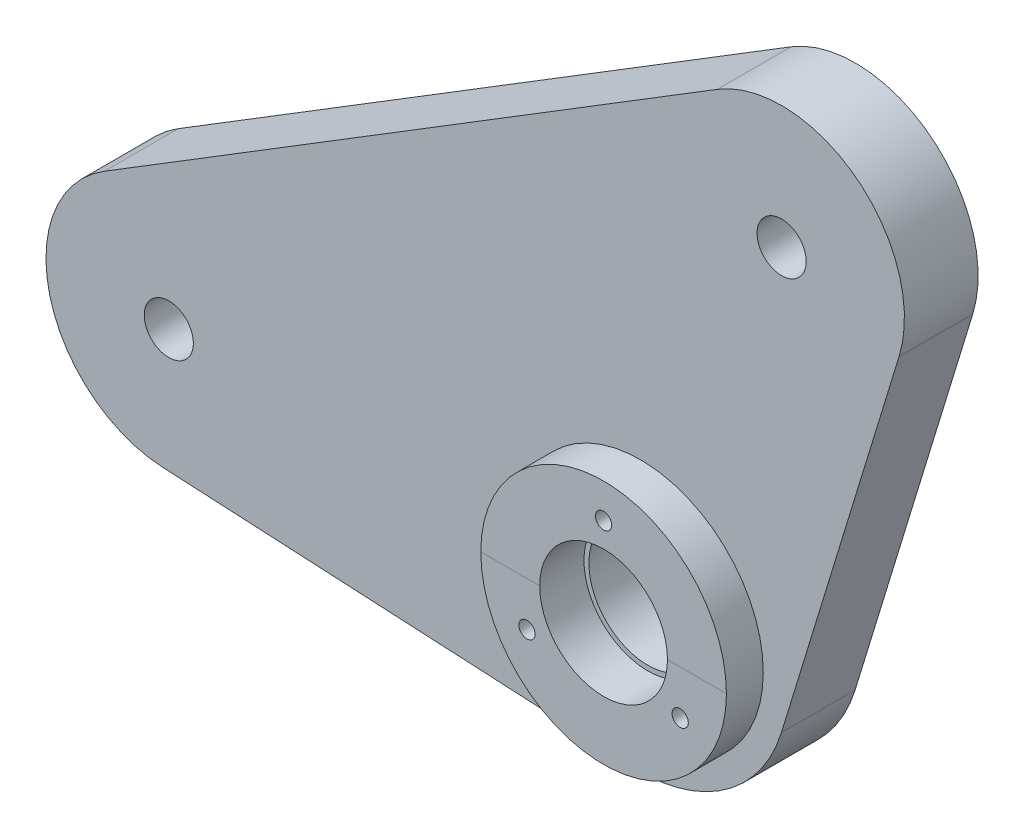
ISO-10303-21;
HEADER;
FILE_DESCRIPTION(('STEP AP214'),'2;1');
FILE_NAME('part.step','',(''),(''),'','','');
FILE_SCHEMA(('AUTOMOTIVE_DESIGN { 1 0 10303 214 1 1 1 1 }'));
ENDSEC;
DATA;
#1=APPLICATION_CONTEXT('core data for automotive mechanical design processes');
#2=APPLICATION_PROTOCOL_DEFINITION('international standard','automotive_design',2000,#1);
#3=PRODUCT_CONTEXT('',#1,'mechanical');
#4=PRODUCT('Part','Part','',(#3));
#5=PRODUCT_RELATED_PRODUCT_CATEGORY('part','',(#4));
#6=PRODUCT_DEFINITION_FORMATION('','',#4);
#7=PRODUCT_DEFINITION_CONTEXT('part definition',#1,'design');
#8=PRODUCT_DEFINITION('design','',#6,#7);
#9=PRODUCT_DEFINITION_SHAPE('','',#8);
#10=(LENGTH_UNIT() NAMED_UNIT(*) SI_UNIT(.MILLI.,.METRE.));
#11=(NAMED_UNIT(*) PLANE_ANGLE_UNIT() SI_UNIT($,.RADIAN.));
#12=(NAMED_UNIT(*) SI_UNIT($,.STERADIAN.) SOLID_ANGLE_UNIT());
#13=UNCERTAINTY_MEASURE_WITH_UNIT(LENGTH_MEASURE(1.E-05),#10,'distance_accuracy_value','');
#14=(GEOMETRIC_REPRESENTATION_CONTEXT(3) GLOBAL_UNCERTAINTY_ASSIGNED_CONTEXT((#13)) GLOBAL_UNIT_ASSIGNED_CONTEXT((#10,
#11,#12)) REPRESENTATION_CONTEXT('',''));
#15=CARTESIAN_POINT('',(0.,0.,0.));
#16=DIRECTION('',(0.,0.,1.));
#17=DIRECTION('',(1.,0.,0.));
#18=AXIS2_PLACEMENT_3D('',#15,#16,#17);
#19=CARTESIAN_POINT('',(0.,0.,15.));
#20=DIRECTION('',(0.,0.,1.));
#21=DIRECTION('',(1.,0.,0.));
#22=AXIS2_PLACEMENT_3D('',#19,#20,#21);
#23=PLANE('',#22);
#24=CARTESIAN_POINT('',(-15.5884572681198,-9.00000000000008,15.));
#25=DIRECTION('',(0.,0.,1.));
#26=DIRECTION('',(1.,0.,0.));
#27=AXIS2_PLACEMENT_3D('',#24,#25,#26);
#28=CIRCLE('',#27,1.64999999999999);
#29=CARTESIAN_POINT('',(-13.9384572681199,-9.00000000000008,15.));
#30=VERTEX_POINT('',#29);
#31=EDGE_CURVE('E178',#30,#30,#28,.T.);
#32=ORIENTED_EDGE('',*,*,#31,.F.);
#33=EDGE_LOOP('',(#32));
#34=FACE_BOUND('',#33,.T.);
#35=CARTESIAN_POINT('',(15.5884572681199,-9.00000000000007,15.));
#36=DIRECTION('',(0.,0.,1.));
#37=DIRECTION('',(1.,0.,0.));
#38=AXIS2_PLACEMENT_3D('',#35,#36,#37);
#39=CIRCLE('',#38,1.64999999999999);
#40=CARTESIAN_POINT('',(17.2384572681198,-9.00000000000007,15.));
#41=VERTEX_POINT('',#40);
#42=EDGE_CURVE('E172',#41,#41,#39,.T.);
#43=ORIENTED_EDGE('',*,*,#42,.F.);
#44=EDGE_LOOP('',(#43));
#45=FACE_BOUND('',#44,.T.);
#46=CARTESIAN_POINT('',(0.,0.,15.));
#47=DIRECTION('',(0.,0.,1.));
#48=DIRECTION('',(1.,0.,0.));
#49=AXIS2_PLACEMENT_3D('',#46,#47,#48);
#50=CIRCLE('',#49,13.);
#51=CARTESIAN_POINT('',(-13.,0.,15.));
#52=VERTEX_POINT('',#51);
#53=CARTESIAN_POINT('',(13.,0.,15.));
#54=VERTEX_POINT('',#53);
#55=EDGE_CURVE('E199',#52,#54,#50,.T.);
#56=ORIENTED_EDGE('',*,*,#55,.F.);
#57=DIRECTION('',(-1.,0.,0.));
#58=VECTOR('',#57,1.);
#59=CARTESIAN_POINT('',(0.,0.,15.));
#60=LINE('',#59,#58);
#61=CARTESIAN_POINT('',(-25.,0.,15.));
#62=VERTEX_POINT('',#61);
#63=EDGE_CURVE('E13',#52,#62,#60,.T.);
#64=ORIENTED_EDGE('',*,*,#63,.T.);
#65=CARTESIAN_POINT('',(0.,0.,15.));
#66=DIRECTION('',(0.,0.,1.));
#67=DIRECTION('',(1.,0.,0.));
#68=AXIS2_PLACEMENT_3D('',#65,#66,#67);
#69=CIRCLE('',#68,25.);
#70=CARTESIAN_POINT('',(25.,0.,15.));
#71=VERTEX_POINT('',#70);
#72=EDGE_CURVE('E304',#62,#71,#69,.T.);
#73=ORIENTED_EDGE('',*,*,#72,.T.);
#74=DIRECTION('',(-1.,0.,0.));
#75=VECTOR('',#74,1.);
#76=CARTESIAN_POINT('',(0.,0.,15.));
#77=LINE('',#76,#75);
#78=EDGE_CURVE('E65',#71,#54,#77,.T.);
#79=ORIENTED_EDGE('',*,*,#78,.T.);
#80=EDGE_LOOP('',(#56,#64,#73,#79));
#81=FACE_BOUND('',#80,.T.);
#82=ADVANCED_FACE('F56',(#34,#45,#81),#23,.T.);
#83=CARTESIAN_POINT('',(0.,0.,-15.));
#84=DIRECTION('',(0.,0.,1.));
#85=DIRECTION('',(1.,0.,0.));
#86=AXIS2_PLACEMENT_3D('',#83,#84,#85);
#87=CYLINDRICAL_SURFACE('',#86,12.);
#88=CARTESIAN_POINT('',(0.,0.,6.));
#89=DIRECTION('',(0.,0.,1.));
#90=DIRECTION('',(1.,0.,0.));
#91=AXIS2_PLACEMENT_3D('',#88,#89,#90);
#92=CIRCLE('',#91,12.);
#93=CARTESIAN_POINT('',(12.,0.,6.));
#94=VERTEX_POINT('',#93);
#95=EDGE_CURVE('E194',#94,#94,#92,.F.);
#96=ORIENTED_EDGE('',*,*,#95,.F.);
#97=EDGE_LOOP('',(#96));
#98=FACE_BOUND('',#97,.T.);
#99=CARTESIAN_POINT('',(0.,0.,-6.));
#100=DIRECTION('',(0.,0.,-1.));
#101=DIRECTION('',(-1.,0.,0.));
#102=AXIS2_PLACEMENT_3D('',#99,#100,#101);
#103=CIRCLE('',#102,12.);
#104=CARTESIAN_POINT('',(-12.,0.,-6.));
#105=VERTEX_POINT('',#104);
#106=EDGE_CURVE('E188',#105,#105,#103,.F.);
#107=ORIENTED_EDGE('',*,*,#106,.F.);
#108=EDGE_LOOP('',(#107));
#109=FACE_BOUND('',#108,.T.);
#110=ADVANCED_FACE('F327',(#98,#109),#87,.F.);
#111=CARTESIAN_POINT('',(-96.,0.,7.5));
#112=DIRECTION('',(0.,0.,-1.));
#113=DIRECTION('',(-1.,0.,0.));
#114=AXIS2_PLACEMENT_3D('',#111,#112,#113);
#115=CYLINDRICAL_SURFACE('',#114,25.);
#116=CARTESIAN_POINT('',(-96.,0.,-7.5));
#117=DIRECTION('',(0.,0.,1.));
#118=DIRECTION('',(1.,0.,0.));
#119=AXIS2_PLACEMENT_3D('',#116,#117,#118);
#120=CIRCLE('',#119,25.);
#121=CARTESIAN_POINT('',(-109.107307638029,21.2884589973548,-7.5));
#122=VERTEX_POINT('',#121);
#123=CARTESIAN_POINT('',(-97.3020833333333,-24.9660685529992,-7.5));
#124=VERTEX_POINT('',#123);
#125=EDGE_CURVE('E279',#122,#124,#120,.T.);
#126=ORIENTED_EDGE('',*,*,#125,.T.);
#127=DIRECTION('',(0.,0.,-1.));
#128=VECTOR('',#127,1.);
#129=CARTESIAN_POINT('',(-97.3020833333333,-24.9660685529992,7.5));
#130=LINE('',#129,#128);
#131=CARTESIAN_POINT('',(-97.3020833333333,-24.9660685529992,7.5));
#132=VERTEX_POINT('',#131);
#133=EDGE_CURVE('E292',#132,#124,#130,.T.);
#134=ORIENTED_EDGE('',*,*,#133,.F.);
#135=CARTESIAN_POINT('',(-96.,0.,7.5));
#136=DIRECTION('',(0.,0.,1.));
#137=DIRECTION('',(1.,0.,0.));
#138=AXIS2_PLACEMENT_3D('',#135,#136,#137);
#139=CIRCLE('',#138,25.);
#140=CARTESIAN_POINT('',(-109.107307638029,21.2884589973548,7.5));
#141=VERTEX_POINT('',#140);
#142=EDGE_CURVE('E234',#141,#132,#139,.T.);
#143=ORIENTED_EDGE('',*,*,#142,.F.);
#144=DIRECTION('',(0.,0.,-1.));
#145=VECTOR('',#144,1.);
#146=CARTESIAN_POINT('',(-109.107307638029,21.2884589973548,7.5));
#147=LINE('',#146,#145);
#148=EDGE_CURVE('E273',#141,#122,#147,.T.);
#149=ORIENTED_EDGE('',*,*,#148,.T.);
#150=EDGE_LOOP('',(#126,#134,#143,#149));
#151=FACE_BOUND('',#150,.T.);
#152=ADVANCED_FACE('F58',(#151),#115,.T.);
#153=CARTESIAN_POINT('',(-97.3020833333333,-24.9660685529992,7.5));
#154=DIRECTION('',(0.0520833333333332,0.998642742119968,0.));
#155=DIRECTION('',(-0.998642742119968,0.0520833333333332,0.));
#156=AXIS2_PLACEMENT_3D('',#153,#154,#155);
#157=PLANE('',#156);
#158=DIRECTION('',(0.998642742119968,-0.0520833333333332,0.));
#159=VECTOR('',#158,1.);
#160=CARTESIAN_POINT('',(-97.3020833333333,-24.9660685529992,-7.5));
#161=LINE('',#160,#159);
#162=CARTESIAN_POINT('',(-1.5625,-29.959282263599,-7.5));
#163=VERTEX_POINT('',#162);
#164=EDGE_CURVE('E282',#124,#163,#161,.T.);
#165=ORIENTED_EDGE('',*,*,#164,.T.);
#166=DIRECTION('',(0.,0.,-1.));
#167=VECTOR('',#166,1.);
#168=CARTESIAN_POINT('',(-1.5625,-29.959282263599,7.5));
#169=LINE('',#168,#167);
#170=CARTESIAN_POINT('',(-1.5625,-29.959282263599,7.5));
#171=VERTEX_POINT('',#170);
#172=EDGE_CURVE('E257',#171,#163,#169,.T.);
#173=ORIENTED_EDGE('',*,*,#172,.F.);
#174=DIRECTION('',(0.998642742119968,-0.0520833333333332,0.));
#175=VECTOR('',#174,1.);
#176=CARTESIAN_POINT('',(-97.3020833333333,-24.9660685529992,7.5));
#177=LINE('',#176,#175);
#178=EDGE_CURVE('E237',#132,#171,#177,.T.);
#179=ORIENTED_EDGE('',*,*,#178,.F.);
#180=ORIENTED_EDGE('',*,*,#133,.T.);
#181=EDGE_LOOP('',(#165,#173,#179,#180));
#182=FACE_BOUND('',#181,.T.);
#183=ADVANCED_FACE('F377',(#182),#157,.F.);
#184=CARTESIAN_POINT('',(0.,0.,7.5));
#185=DIRECTION('',(0.,0.,-1.));
#186=DIRECTION('',(-1.,0.,0.));
#187=AXIS2_PLACEMENT_3D('',#184,#185,#186);
#188=CYLINDRICAL_SURFACE('',#187,30.);
#189=CARTESIAN_POINT('',(0.,0.,-7.5));
#190=DIRECTION('',(0.,0.,1.));
#191=DIRECTION('',(1.,0.,0.));
#192=AXIS2_PLACEMENT_3D('',#189,#190,#191);
#193=CIRCLE('',#192,30.);
#194=CARTESIAN_POINT('',(28.6863265068597,-8.78035714204369,-7.5));
#195=VERTEX_POINT('',#194);
#196=EDGE_CURVE('E254',#163,#195,#193,.T.);
#197=ORIENTED_EDGE('',*,*,#196,.T.);
#198=DIRECTION('',(0.,0.,-1.));
#199=VECTOR('',#198,1.);
#200=CARTESIAN_POINT('',(28.6863265068597,-8.78035714204369,7.5));
#201=LINE('',#200,#199);
#202=CARTESIAN_POINT('',(28.6863265068597,-8.78035714204369,7.5));
#203=VERTEX_POINT('',#202);
#204=EDGE_CURVE('E251',#203,#195,#201,.T.);
#205=ORIENTED_EDGE('',*,*,#204,.F.);
#206=CARTESIAN_POINT('',(0.,0.,7.5));
#207=DIRECTION('',(0.,0.,1.));
#208=DIRECTION('',(1.,0.,0.));
#209=AXIS2_PLACEMENT_3D('',#206,#207,#208);
#210=CIRCLE('',#209,30.);
#211=EDGE_CURVE('E211',#171,#203,#210,.T.);
#212=ORIENTED_EDGE('',*,*,#211,.F.);
#213=ORIENTED_EDGE('',*,*,#172,.T.);
#214=EDGE_LOOP('',(#197,#205,#212,#213));
#215=FACE_BOUND('',#214,.T.);
#216=ADVANCED_FACE('F252',(#215),#188,.T.);
#217=CARTESIAN_POINT('',(28.6863265068597,-8.78035714204369,7.5));
#218=DIRECTION('',(-0.956210883561991,0.292678571401456,0.));
#219=DIRECTION('',(-0.292678571401456,-0.956210883561991,0.));
#220=AXIS2_PLACEMENT_3D('',#217,#218,#219);
#221=PLANE('',#220);
#222=DIRECTION('',(0.292678571401456,0.956210883561991,0.));
#223=VECTOR('',#222,1.);
#224=CARTESIAN_POINT('',(28.6863265068597,-8.78035714204369,-7.5));
#225=LINE('',#224,#223);
#226=CARTESIAN_POINT('',(52.6413121781087,69.4830357149636,-7.5));
#227=VERTEX_POINT('',#226);
#228=EDGE_CURVE('E263',#195,#227,#225,.T.);
#229=ORIENTED_EDGE('',*,*,#228,.T.);
#230=DIRECTION('',(0.,0.,-1.));
#231=VECTOR('',#230,1.);
#232=CARTESIAN_POINT('',(52.6413121781087,69.4830357149636,7.5));
#233=LINE('',#232,#231);
#234=CARTESIAN_POINT('',(52.6413121781087,69.4830357149636,7.5));
#235=VERTEX_POINT('',#234);
#236=EDGE_CURVE('E258',#235,#227,#233,.T.);
#237=ORIENTED_EDGE('',*,*,#236,.F.);
#238=DIRECTION('',(0.292678571401456,0.956210883561991,0.));
#239=VECTOR('',#238,1.);
#240=CARTESIAN_POINT('',(28.6863265068597,-8.78035714204369,7.5));
#241=LINE('',#240,#239);
#242=EDGE_CURVE('E206',#203,#235,#241,.T.);
#243=ORIENTED_EDGE('',*,*,#242,.F.);
#244=ORIENTED_EDGE('',*,*,#204,.T.);
#245=EDGE_LOOP('',(#229,#237,#243,#244));
#246=FACE_BOUND('',#245,.T.);
#247=ADVANCED_FACE('F260',(#246),#221,.F.);
#248=CARTESIAN_POINT('',(28.7360400890589,76.8,7.5));
#249=DIRECTION('',(0.,0.,-1.));
#250=DIRECTION('',(-1.,0.,0.));
#251=AXIS2_PLACEMENT_3D('',#248,#249,#250);
#252=CYLINDRICAL_SURFACE('',#251,25.);
#253=CARTESIAN_POINT('',(28.7360400890589,76.8,-7.5));
#254=DIRECTION('',(0.,0.,1.));
#255=DIRECTION('',(1.,0.,0.));
#256=AXIS2_PLACEMENT_3D('',#253,#254,#255);
#257=CIRCLE('',#256,25.);
#258=CARTESIAN_POINT('',(15.6287324510297,98.0884589973549,-7.5));
#259=VERTEX_POINT('',#258);
#260=EDGE_CURVE('E287',#227,#259,#257,.T.);
#261=ORIENTED_EDGE('',*,*,#260,.T.);
#262=DIRECTION('',(0.,0.,-1.));
#263=VECTOR('',#262,1.);
#264=CARTESIAN_POINT('',(15.6287324510297,98.0884589973549,7.5));
#265=LINE('',#264,#263);
#266=CARTESIAN_POINT('',(15.6287324510297,98.0884589973549,7.5));
#267=VERTEX_POINT('',#266);
#268=EDGE_CURVE('E266',#267,#259,#265,.T.);
#269=ORIENTED_EDGE('',*,*,#268,.F.);
#270=CARTESIAN_POINT('',(28.7360400890589,76.8,7.5));
#271=DIRECTION('',(0.,0.,1.));
#272=DIRECTION('',(1.,0.,0.));
#273=AXIS2_PLACEMENT_3D('',#270,#271,#272);
#274=CIRCLE('',#273,25.);
#275=EDGE_CURVE('E210',#235,#267,#274,.T.);
#276=ORIENTED_EDGE('',*,*,#275,.F.);
#277=ORIENTED_EDGE('',*,*,#236,.T.);
#278=EDGE_LOOP('',(#261,#269,#276,#277));
#279=FACE_BOUND('',#278,.T.);
#280=ADVANCED_FACE('F269',(#279),#252,.T.);
#281=CARTESIAN_POINT('',(-109.107307638029,21.2884589973548,7.5));
#282=DIRECTION('',(0.524292305521172,-0.851538359894194,0.));
#283=DIRECTION('',(0.851538359894194,0.524292305521172,0.));
#284=AXIS2_PLACEMENT_3D('',#281,#282,#283);
#285=PLANE('',#284);
#286=DIRECTION('',(-0.851538359894194,-0.524292305521172,0.));
#287=VECTOR('',#286,1.);
#288=CARTESIAN_POINT('',(-109.107307638029,21.2884589973548,-7.5));
#289=LINE('',#288,#287);
#290=EDGE_CURVE('E238',#259,#122,#289,.T.);
#291=ORIENTED_EDGE('',*,*,#290,.T.);
#292=ORIENTED_EDGE('',*,*,#148,.F.);
#293=DIRECTION('',(-0.851538359894194,-0.524292305521172,0.));
#294=VECTOR('',#293,1.);
#295=CARTESIAN_POINT('',(-109.107307638029,21.2884589973548,7.5));
#296=LINE('',#295,#294);
#297=EDGE_CURVE('E272',#267,#141,#296,.T.);
#298=ORIENTED_EDGE('',*,*,#297,.F.);
#299=ORIENTED_EDGE('',*,*,#268,.T.);
#300=EDGE_LOOP('',(#291,#292,#298,#299));
#301=FACE_BOUND('',#300,.T.);
#302=ADVANCED_FACE('F364',(#301),#285,.F.);
#303=CARTESIAN_POINT('',(-96.,0.,7.5));
#304=DIRECTION('',(0.,0.,1.));
#305=DIRECTION('',(1.,0.,0.));
#306=AXIS2_PLACEMENT_3D('',#303,#304,#305);
#307=PLANE('',#306);
#308=CARTESIAN_POINT('',(0.,0.,7.5));
#309=DIRECTION('',(0.,0.,1.));
#310=DIRECTION('',(1.,0.,0.));
#311=AXIS2_PLACEMENT_3D('',#308,#309,#310);
#312=CIRCLE('',#311,25.);
#313=CARTESIAN_POINT('',(25.,0.,7.5));
#314=VERTEX_POINT('',#313);
#315=EDGE_CURVE('E233',#314,#314,#312,.F.);
#316=ORIENTED_EDGE('',*,*,#315,.T.);
#317=EDGE_LOOP('',(#316));
#318=FACE_BOUND('',#317,.T.);
#319=CARTESIAN_POINT('',(-96.,0.,7.5));
#320=DIRECTION('',(0.,0.,1.));
#321=DIRECTION('',(1.,0.,0.));
#322=AXIS2_PLACEMENT_3D('',#319,#320,#321);
#323=CIRCLE('',#322,5.);
#324=CARTESIAN_POINT('',(-91.,0.,7.5));
#325=VERTEX_POINT('',#324);
#326=EDGE_CURVE('E226',#325,#325,#323,.T.);
#327=ORIENTED_EDGE('',*,*,#326,.F.);
#328=EDGE_LOOP('',(#327));
#329=FACE_BOUND('',#328,.T.);
#330=CARTESIAN_POINT('',(28.7360400890589,76.8,7.5));
#331=DIRECTION('',(0.,0.,1.));
#332=DIRECTION('',(1.,0.,0.));
#333=AXIS2_PLACEMENT_3D('',#330,#331,#332);
#334=CIRCLE('',#333,5.);
#335=CARTESIAN_POINT('',(33.7360400890589,76.8,7.5));
#336=VERTEX_POINT('',#335);
#337=EDGE_CURVE('E222',#336,#336,#334,.T.);
#338=ORIENTED_EDGE('',*,*,#337,.F.);
#339=EDGE_LOOP('',(#338));
#340=FACE_BOUND('',#339,.T.);
#341=ORIENTED_EDGE('',*,*,#142,.T.);
#342=ORIENTED_EDGE('',*,*,#178,.T.);
#343=ORIENTED_EDGE('',*,*,#211,.T.);
#344=ORIENTED_EDGE('',*,*,#242,.T.);
#345=ORIENTED_EDGE('',*,*,#275,.T.);
#346=ORIENTED_EDGE('',*,*,#297,.T.);
#347=EDGE_LOOP('',(#341,#342,#343,#344,#345,#346));
#348=FACE_BOUND('',#347,.T.);
#349=ADVANCED_FACE('F245',(#318,#329,#340,#348),#307,.T.);
#350=CARTESIAN_POINT('',(-96.,0.,-7.5));
#351=DIRECTION('',(0.,0.,1.));
#352=DIRECTION('',(1.,0.,0.));
#353=AXIS2_PLACEMENT_3D('',#350,#351,#352);
#354=PLANE('',#353);
#355=CARTESIAN_POINT('',(0.,0.,-7.5));
#356=DIRECTION('',(0.,0.,1.));
#357=DIRECTION('',(1.,0.,0.));
#358=AXIS2_PLACEMENT_3D('',#355,#356,#357);
#359=CIRCLE('',#358,25.);
#360=CARTESIAN_POINT('',(25.,0.,-7.5));
#361=VERTEX_POINT('',#360);
#362=EDGE_CURVE('E295',#361,#361,#359,.F.);
#363=ORIENTED_EDGE('',*,*,#362,.F.);
#364=EDGE_LOOP('',(#363));
#365=FACE_BOUND('',#364,.T.);
#366=CARTESIAN_POINT('',(-96.,0.,-7.5));
#367=DIRECTION('',(0.,0.,1.));
#368=DIRECTION('',(1.,0.,0.));
#369=AXIS2_PLACEMENT_3D('',#366,#367,#368);
#370=CIRCLE('',#369,5.);
#371=CARTESIAN_POINT('',(-91.,0.,-7.5));
#372=VERTEX_POINT('',#371);
#373=EDGE_CURVE('E283',#372,#372,#370,.T.);
#374=ORIENTED_EDGE('',*,*,#373,.T.);
#375=EDGE_LOOP('',(#374));
#376=FACE_BOUND('',#375,.T.);
#377=CARTESIAN_POINT('',(28.7360400890589,76.8,-7.5));
#378=DIRECTION('',(0.,0.,1.));
#379=DIRECTION('',(1.,0.,0.));
#380=AXIS2_PLACEMENT_3D('',#377,#378,#379);
#381=CIRCLE('',#380,5.);
#382=CARTESIAN_POINT('',(33.7360400890589,76.8,-7.5));
#383=VERTEX_POINT('',#382);
#384=EDGE_CURVE('E227',#383,#383,#381,.T.);
#385=ORIENTED_EDGE('',*,*,#384,.T.);
#386=EDGE_LOOP('',(#385));
#387=FACE_BOUND('',#386,.T.);
#388=ORIENTED_EDGE('',*,*,#125,.F.);
#389=ORIENTED_EDGE('',*,*,#290,.F.);
#390=ORIENTED_EDGE('',*,*,#260,.F.);
#391=ORIENTED_EDGE('',*,*,#228,.F.);
#392=ORIENTED_EDGE('',*,*,#196,.F.);
#393=ORIENTED_EDGE('',*,*,#164,.F.);
#394=EDGE_LOOP('',(#388,#389,#390,#391,#392,#393));
#395=FACE_BOUND('',#394,.T.);
#396=ADVANCED_FACE('F360',(#365,#376,#387,#395),#354,.F.);
#397=CARTESIAN_POINT('',(28.7360400890589,76.8,-7.5));
#398=DIRECTION('',(0.,0.,1.));
#399=DIRECTION('',(1.,0.,0.));
#400=AXIS2_PLACEMENT_3D('',#397,#398,#399);
#401=CYLINDRICAL_SURFACE('',#400,5.);
#402=ORIENTED_EDGE('',*,*,#384,.F.);
#403=EDGE_LOOP('',(#402));
#404=FACE_BOUND('',#403,.T.);
#405=ORIENTED_EDGE('',*,*,#337,.T.);
#406=EDGE_LOOP('',(#405));
#407=FACE_BOUND('',#406,.T.);
#408=ADVANCED_FACE('F356',(#404,#407),#401,.F.);
#409=CARTESIAN_POINT('',(-96.,0.,-7.5));
#410=DIRECTION('',(0.,0.,1.));
#411=DIRECTION('',(1.,0.,0.));
#412=AXIS2_PLACEMENT_3D('',#409,#410,#411);
#413=CYLINDRICAL_SURFACE('',#412,5.);
#414=ORIENTED_EDGE('',*,*,#373,.F.);
#415=EDGE_LOOP('',(#414));
#416=FACE_BOUND('',#415,.T.);
#417=ORIENTED_EDGE('',*,*,#326,.T.);
#418=EDGE_LOOP('',(#417));
#419=FACE_BOUND('',#418,.T.);
#420=ADVANCED_FACE('F353',(#416,#419),#413,.F.);
#421=CARTESIAN_POINT('',(0.,0.,-15.));
#422=DIRECTION('',(0.,0.,1.));
#423=DIRECTION('',(1.,0.,0.));
#424=AXIS2_PLACEMENT_3D('',#421,#422,#423);
#425=PLANE('',#424);
#426=CARTESIAN_POINT('',(0.,18.,-15.));
#427=DIRECTION('',(0.,0.,-1.));
#428=DIRECTION('',(-1.,0.,0.));
#429=AXIS2_PLACEMENT_3D('',#426,#427,#428);
#430=CIRCLE('',#429,1.64999999999999);
#431=CARTESIAN_POINT('',(-1.64999999999999,18.,-15.));
#432=VERTEX_POINT('',#431);
#433=EDGE_CURVE('E150',#432,#432,#430,.T.);
#434=ORIENTED_EDGE('',*,*,#433,.F.);
#435=EDGE_LOOP('',(#434));
#436=FACE_BOUND('',#435,.T.);
#437=CARTESIAN_POINT('',(-15.5854674215915,-8.99827381130211,-15.));
#438=DIRECTION('',(0.,0.,-1.));
#439=DIRECTION('',(-1.,0.,0.));
#440=AXIS2_PLACEMENT_3D('',#437,#438,#439);
#441=CIRCLE('',#440,1.64999999999999);
#442=CARTESIAN_POINT('',(-17.2354674215915,-8.99827381130211,-15.));
#443=VERTEX_POINT('',#442);
#444=EDGE_CURVE('E149',#443,#443,#441,.T.);
#445=ORIENTED_EDGE('',*,*,#444,.F.);
#446=EDGE_LOOP('',(#445));
#447=FACE_BOUND('',#446,.T.);
#448=CARTESIAN_POINT('',(15.5884572681198,-9.00000000000008,-15.));
#449=DIRECTION('',(0.,0.,-1.));
#450=DIRECTION('',(-1.,0.,0.));
#451=AXIS2_PLACEMENT_3D('',#448,#449,#450);
#452=CIRCLE('',#451,1.64999999999999);
#453=CARTESIAN_POINT('',(13.9384572681199,-9.00000000000008,-15.));
#454=VERTEX_POINT('',#453);
#455=EDGE_CURVE('E160',#454,#454,#452,.T.);
#456=ORIENTED_EDGE('',*,*,#455,.F.);
#457=EDGE_LOOP('',(#456));
#458=FACE_BOUND('',#457,.T.);
#459=CARTESIAN_POINT('',(0.,0.,-15.));
#460=DIRECTION('',(0.,0.,-1.));
#461=DIRECTION('',(-1.,0.,0.));
#462=AXIS2_PLACEMENT_3D('',#459,#460,#461);
#463=CIRCLE('',#462,13.);
#464=CARTESIAN_POINT('',(-13.,0.,-15.));
#465=VERTEX_POINT('',#464);
#466=EDGE_CURVE('E184',#465,#465,#463,.T.);
#467=ORIENTED_EDGE('',*,*,#466,.F.);
#468=EDGE_LOOP('',(#467));
#469=FACE_BOUND('',#468,.T.);
#470=CARTESIAN_POINT('',(0.,0.,-15.));
#471=DIRECTION('',(0.,0.,1.));
#472=DIRECTION('',(1.,0.,0.));
#473=AXIS2_PLACEMENT_3D('',#470,#471,#472);
#474=CIRCLE('',#473,25.);
#475=CARTESIAN_POINT('',(25.,0.,-15.));
#476=VERTEX_POINT('',#475);
#477=EDGE_CURVE('E300',#476,#476,#474,.T.);
#478=ORIENTED_EDGE('',*,*,#477,.F.);
#479=EDGE_LOOP('',(#478));
#480=FACE_BOUND('',#479,.T.);
#481=ADVANCED_FACE('F348',(#436,#447,#458,#469,#480),#425,.F.);
#482=CARTESIAN_POINT('',(0.,0.,15.));
#483=DIRECTION('',(0.,0.,-1.));
#484=DIRECTION('',(-1.,0.,0.));
#485=AXIS2_PLACEMENT_3D('',#482,#483,#484);
#486=CYLINDRICAL_SURFACE('',#485,25.);
#487=ORIENTED_EDGE('',*,*,#477,.T.);
#488=EDGE_LOOP('',(#487));
#489=FACE_BOUND('',#488,.T.);
#490=ORIENTED_EDGE('',*,*,#362,.T.);
#491=EDGE_LOOP('',(#490));
#492=FACE_BOUND('',#491,.T.);
#493=ADVANCED_FACE('F342',(#489,#492),#486,.T.);
#494=ORIENTED_EDGE('',*,*,#315,.F.);
#495=EDGE_LOOP('',(#494));
#496=FACE_BOUND('',#495,.T.);
#497=EDGE_CURVE('E200',#71,#62,#69,.T.);
#498=ORIENTED_EDGE('',*,*,#497,.F.);
#499=ORIENTED_EDGE('',*,*,#72,.F.);
#500=EDGE_LOOP('',(#498,#499));
#501=FACE_BOUND('',#500,.T.);
#502=ADVANCED_FACE('F338',(#496,#501),#486,.T.);
#503=ORIENTED_EDGE('',*,*,#63,.F.);
#504=EDGE_CURVE('E195',#54,#52,#50,.T.);
#505=ORIENTED_EDGE('',*,*,#504,.F.);
#506=ORIENTED_EDGE('',*,*,#78,.F.);
#507=ORIENTED_EDGE('',*,*,#497,.T.);
#508=EDGE_LOOP('',(#503,#505,#506,#507));
#509=FACE_BOUND('',#508,.T.);
#510=CARTESIAN_POINT('',(0.,18.,15.));
#511=DIRECTION('',(0.,0.,1.));
#512=DIRECTION('',(1.,0.,0.));
#513=AXIS2_PLACEMENT_3D('',#510,#511,#512);
#514=CIRCLE('',#513,1.64999999999999);
#515=CARTESIAN_POINT('',(1.64999999999999,18.,15.));
#516=VERTEX_POINT('',#515);
#517=EDGE_CURVE('E166',#516,#516,#514,.T.);
#518=ORIENTED_EDGE('',*,*,#517,.F.);
#519=EDGE_LOOP('',(#518));
#520=FACE_BOUND('',#519,.T.);
#521=ADVANCED_FACE('F306',(#509,#520),#23,.T.);
#522=CARTESIAN_POINT('',(0.,0.,6.));
#523=DIRECTION('',(0.,0.,1.));
#524=DIRECTION('',(1.,0.,0.));
#525=AXIS2_PLACEMENT_3D('',#522,#523,#524);
#526=PLANE('',#525);
#527=CARTESIAN_POINT('',(0.,0.,6.));
#528=DIRECTION('',(0.,0.,1.));
#529=DIRECTION('',(1.,0.,0.));
#530=AXIS2_PLACEMENT_3D('',#527,#528,#529);
#531=CIRCLE('',#530,13.);
#532=CARTESIAN_POINT('',(13.,0.,6.));
#533=VERTEX_POINT('',#532);
#534=EDGE_CURVE('E191',#533,#533,#531,.T.);
#535=ORIENTED_EDGE('',*,*,#534,.T.);
#536=EDGE_LOOP('',(#535));
#537=FACE_BOUND('',#536,.T.);
#538=ORIENTED_EDGE('',*,*,#95,.T.);
#539=EDGE_LOOP('',(#538));
#540=FACE_BOUND('',#539,.T.);
#541=ADVANCED_FACE('F312',(#537,#540),#526,.T.);
#542=CARTESIAN_POINT('',(0.,0.,6.));
#543=DIRECTION('',(0.,0.,1.));
#544=DIRECTION('',(1.,0.,0.));
#545=AXIS2_PLACEMENT_3D('',#542,#543,#544);
#546=CYLINDRICAL_SURFACE('',#545,13.);
#547=ORIENTED_EDGE('',*,*,#534,.F.);
#548=EDGE_LOOP('',(#547));
#549=FACE_BOUND('',#548,.T.);
#550=ORIENTED_EDGE('',*,*,#504,.T.);
#551=ORIENTED_EDGE('',*,*,#55,.T.);
#552=EDGE_LOOP('',(#550,#551));
#553=FACE_BOUND('',#552,.T.);
#554=ADVANCED_FACE('F309',(#549,#553),#546,.F.);
#555=CARTESIAN_POINT('',(0.,0.,-6.));
#556=DIRECTION('',(0.,0.,-1.));
#557=DIRECTION('',(-1.,0.,0.));
#558=AXIS2_PLACEMENT_3D('',#555,#556,#557);
#559=PLANE('',#558);
#560=CARTESIAN_POINT('',(0.,0.,-6.));
#561=DIRECTION('',(0.,0.,-1.));
#562=DIRECTION('',(-1.,0.,0.));
#563=AXIS2_PLACEMENT_3D('',#560,#561,#562);
#564=CIRCLE('',#563,13.);
#565=CARTESIAN_POINT('',(-13.,0.,-6.));
#566=VERTEX_POINT('',#565);
#567=EDGE_CURVE('E185',#566,#566,#564,.T.);
#568=ORIENTED_EDGE('',*,*,#567,.T.);
#569=EDGE_LOOP('',(#568));
#570=FACE_BOUND('',#569,.T.);
#571=ORIENTED_EDGE('',*,*,#106,.T.);
#572=EDGE_LOOP('',(#571));
#573=FACE_BOUND('',#572,.T.);
#574=ADVANCED_FACE('F311',(#570,#573),#559,.T.);
#575=CARTESIAN_POINT('',(0.,0.,-6.));
#576=DIRECTION('',(0.,0.,-1.));
#577=DIRECTION('',(-1.,0.,0.));
#578=AXIS2_PLACEMENT_3D('',#575,#576,#577);
#579=CYLINDRICAL_SURFACE('',#578,13.);
#580=ORIENTED_EDGE('',*,*,#567,.F.);
#581=EDGE_LOOP('',(#580));
#582=FACE_BOUND('',#581,.T.);
#583=ORIENTED_EDGE('',*,*,#466,.T.);
#584=EDGE_LOOP('',(#583));
#585=FACE_BOUND('',#584,.T.);
#586=ADVANCED_FACE('F319',(#582,#585),#579,.F.);
#587=CARTESIAN_POINT('',(-15.5884572681198,-9.00000000000008,6.));
#588=DIRECTION('',(0.,0.,1.));
#589=DIRECTION('',(1.,0.,0.));
#590=AXIS2_PLACEMENT_3D('',#587,#588,#589);
#591=CONICAL_SURFACE('',#590,1.65,1.02974425867665);
#592=CARTESIAN_POINT('',(-15.5884572681199,-9.00000000000008,5.00857997860452));
#593=VERTEX_POINT('',#592);
#594=VERTEX_LOOP('',#593);
#595=FACE_BOUND('',#594,.T.);
#596=CARTESIAN_POINT('',(-15.5884572681198,-9.00000000000008,6.));
#597=DIRECTION('',(0.,0.,1.));
#598=DIRECTION('',(1.,0.,0.));
#599=AXIS2_PLACEMENT_3D('',#596,#597,#598);
#600=CIRCLE('',#599,1.65);
#601=CARTESIAN_POINT('',(-13.9384572681199,-9.00000000000008,6.));
#602=VERTEX_POINT('',#601);
#603=EDGE_CURVE('E181',#602,#602,#600,.T.);
#604=ORIENTED_EDGE('',*,*,#603,.T.);
#605=EDGE_LOOP('',(#604));
#606=FACE_BOUND('',#605,.T.);
#607=ADVANCED_FACE('F418',(#595,#606),#591,.F.);
#608=CARTESIAN_POINT('',(-15.5884572681198,-9.00000000000008,15.));
#609=DIRECTION('',(0.,0.,1.));
#610=DIRECTION('',(1.,0.,0.));
#611=AXIS2_PLACEMENT_3D('',#608,#609,#610);
#612=CYLINDRICAL_SURFACE('',#611,1.64999999999999);
#613=ORIENTED_EDGE('',*,*,#603,.F.);
#614=EDGE_LOOP('',(#613));
#615=FACE_BOUND('',#614,.T.);
#616=ORIENTED_EDGE('',*,*,#31,.T.);
#617=EDGE_LOOP('',(#616));
#618=FACE_BOUND('',#617,.T.);
#619=ADVANCED_FACE('F428',(#615,#618),#612,.F.);
#620=CARTESIAN_POINT('',(15.5884572681199,-9.00000000000007,6.));
#621=DIRECTION('',(0.,0.,1.));
#622=DIRECTION('',(1.,0.,0.));
#623=AXIS2_PLACEMENT_3D('',#620,#621,#622);
#624=CONICAL_SURFACE('',#623,1.65,1.02974425867665);
#625=CARTESIAN_POINT('',(15.5884572681199,-9.00000000000007,5.00857997860452));
#626=VERTEX_POINT('',#625);
#627=VERTEX_LOOP('',#626);
#628=FACE_BOUND('',#627,.T.);
#629=CARTESIAN_POINT('',(15.5884572681199,-9.00000000000007,6.));
#630=DIRECTION('',(0.,0.,1.));
#631=DIRECTION('',(1.,0.,0.));
#632=AXIS2_PLACEMENT_3D('',#629,#630,#631);
#633=CIRCLE('',#632,1.65);
#634=CARTESIAN_POINT('',(17.2384572681199,-9.00000000000007,6.));
#635=VERTEX_POINT('',#634);
#636=EDGE_CURVE('E175',#635,#635,#633,.T.);
#637=ORIENTED_EDGE('',*,*,#636,.T.);
#638=EDGE_LOOP('',(#637));
#639=FACE_BOUND('',#638,.T.);
#640=ADVANCED_FACE('F440',(#628,#639),#624,.F.);
#641=CARTESIAN_POINT('',(15.5884572681199,-9.00000000000007,15.));
#642=DIRECTION('',(0.,0.,1.));
#643=DIRECTION('',(1.,0.,0.));
#644=AXIS2_PLACEMENT_3D('',#641,#642,#643);
#645=CYLINDRICAL_SURFACE('',#644,1.64999999999999);
#646=ORIENTED_EDGE('',*,*,#636,.F.);
#647=EDGE_LOOP('',(#646));
#648=FACE_BOUND('',#647,.T.);
#649=ORIENTED_EDGE('',*,*,#42,.T.);
#650=EDGE_LOOP('',(#649));
#651=FACE_BOUND('',#650,.T.);
#652=ADVANCED_FACE('F453',(#648,#651),#645,.F.);
#653=CARTESIAN_POINT('',(0.,18.,6.));
#654=DIRECTION('',(0.,0.,1.));
#655=DIRECTION('',(1.,0.,0.));
#656=AXIS2_PLACEMENT_3D('',#653,#654,#655);
#657=CONICAL_SURFACE('',#656,1.65,1.02974425867665);
#658=CARTESIAN_POINT('',(0.,18.,5.00857997860452));
#659=VERTEX_POINT('',#658);
#660=VERTEX_LOOP('',#659);
#661=FACE_BOUND('',#660,.T.);
#662=CARTESIAN_POINT('',(0.,18.,6.));
#663=DIRECTION('',(0.,0.,1.));
#664=DIRECTION('',(1.,0.,0.));
#665=AXIS2_PLACEMENT_3D('',#662,#663,#664);
#666=CIRCLE('',#665,1.65);
#667=CARTESIAN_POINT('',(1.65,18.,6.));
#668=VERTEX_POINT('',#667);
#669=EDGE_CURVE('E169',#668,#668,#666,.T.);
#670=ORIENTED_EDGE('',*,*,#669,.T.);
#671=EDGE_LOOP('',(#670));
#672=FACE_BOUND('',#671,.T.);
#673=ADVANCED_FACE('F464',(#661,#672),#657,.F.);
#674=CARTESIAN_POINT('',(0.,18.,15.));
#675=DIRECTION('',(0.,0.,1.));
#676=DIRECTION('',(1.,0.,0.));
#677=AXIS2_PLACEMENT_3D('',#674,#675,#676);
#678=CYLINDRICAL_SURFACE('',#677,1.64999999999999);
#679=ORIENTED_EDGE('',*,*,#669,.F.);
#680=EDGE_LOOP('',(#679));
#681=FACE_BOUND('',#680,.T.);
#682=ORIENTED_EDGE('',*,*,#517,.T.);
#683=EDGE_LOOP('',(#682));
#684=FACE_BOUND('',#683,.T.);
#685=ADVANCED_FACE('F477',(#681,#684),#678,.F.);
#686=CARTESIAN_POINT('',(15.5884572681198,-9.00000000000008,-6.));
#687=DIRECTION('',(0.,0.,-1.));
#688=DIRECTION('',(-1.,0.,0.));
#689=AXIS2_PLACEMENT_3D('',#686,#687,#688);
#690=CONICAL_SURFACE('',#689,1.65,1.02974425867665);
#691=CARTESIAN_POINT('',(15.5884572681198,-9.00000000000008,-5.00857997860452));
#692=VERTEX_POINT('',#691);
#693=VERTEX_LOOP('',#692);
#694=FACE_BOUND('',#693,.T.);
#695=CARTESIAN_POINT('',(15.5884572681198,-9.00000000000008,-6.));
#696=DIRECTION('',(0.,0.,-1.));
#697=DIRECTION('',(-1.,0.,0.));
#698=AXIS2_PLACEMENT_3D('',#695,#696,#697);
#699=CIRCLE('',#698,1.65);
#700=CARTESIAN_POINT('',(13.9384572681199,-9.00000000000008,-6.));
#701=VERTEX_POINT('',#700);
#702=EDGE_CURVE('E163',#701,#701,#699,.T.);
#703=ORIENTED_EDGE('',*,*,#702,.T.);
#704=EDGE_LOOP('',(#703));
#705=FACE_BOUND('',#704,.T.);
#706=ADVANCED_FACE('F488',(#694,#705),#690,.F.);
#707=CARTESIAN_POINT('',(15.5884572681198,-9.00000000000008,-15.));
#708=DIRECTION('',(0.,0.,-1.));
#709=DIRECTION('',(-1.,0.,0.));
#710=AXIS2_PLACEMENT_3D('',#707,#708,#709);
#711=CYLINDRICAL_SURFACE('',#710,1.64999999999999);
#712=ORIENTED_EDGE('',*,*,#702,.F.);
#713=EDGE_LOOP('',(#712));
#714=FACE_BOUND('',#713,.T.);
#715=ORIENTED_EDGE('',*,*,#455,.T.);
#716=EDGE_LOOP('',(#715));
#717=FACE_BOUND('',#716,.T.);
#718=ADVANCED_FACE('F515',(#714,#717),#711,.F.);
#719=CARTESIAN_POINT('',(-15.5854674215915,-8.99827381130211,-6.));
#720=DIRECTION('',(0.,0.,-1.));
#721=DIRECTION('',(-1.,0.,0.));
#722=AXIS2_PLACEMENT_3D('',#719,#720,#721);
#723=CONICAL_SURFACE('',#722,1.65,1.02974425867665);
#724=CARTESIAN_POINT('',(-15.5854674215915,-8.99827381130211,-5.00857997860452));
#725=VERTEX_POINT('',#724);
#726=VERTEX_LOOP('',#725);
#727=FACE_BOUND('',#726,.T.);
#728=CARTESIAN_POINT('',(-15.5854674215915,-8.99827381130211,-6.));
#729=DIRECTION('',(0.,0.,-1.));
#730=DIRECTION('',(-1.,0.,0.));
#731=AXIS2_PLACEMENT_3D('',#728,#729,#730);
#732=CIRCLE('',#731,1.65);
#733=CARTESIAN_POINT('',(-17.2354674215915,-8.99827381130211,-6.));
#734=VERTEX_POINT('',#733);
#735=EDGE_CURVE('E153',#734,#734,#732,.T.);
#736=ORIENTED_EDGE('',*,*,#735,.T.);
#737=EDGE_LOOP('',(#736));
#738=FACE_BOUND('',#737,.T.);
#739=ADVANCED_FACE('F526',(#727,#738),#723,.F.);
#740=CARTESIAN_POINT('',(-15.5854674215915,-8.99827381130211,-15.));
#741=DIRECTION('',(0.,0.,-1.));
#742=DIRECTION('',(-1.,0.,0.));
#743=AXIS2_PLACEMENT_3D('',#740,#741,#742);
#744=CYLINDRICAL_SURFACE('',#743,1.64999999999999);
#745=ORIENTED_EDGE('',*,*,#735,.F.);
#746=EDGE_LOOP('',(#745));
#747=FACE_BOUND('',#746,.T.);
#748=ORIENTED_EDGE('',*,*,#444,.T.);
#749=EDGE_LOOP('',(#748));
#750=FACE_BOUND('',#749,.T.);
#751=ADVANCED_FACE('F143',(#747,#750),#744,.F.);
#752=CARTESIAN_POINT('',(0.,18.,-6.));
#753=DIRECTION('',(0.,0.,-1.));
#754=DIRECTION('',(-1.,0.,0.));
#755=AXIS2_PLACEMENT_3D('',#752,#753,#754);
#756=CONICAL_SURFACE('',#755,1.65,1.02974425867665);
#757=CARTESIAN_POINT('',(0.,18.,-5.00857997860452));
#758=VERTEX_POINT('',#757);
#759=VERTEX_LOOP('',#758);
#760=FACE_BOUND('',#759,.T.);
#761=CARTESIAN_POINT('',(0.,18.,-6.));
#762=DIRECTION('',(0.,0.,-1.));
#763=DIRECTION('',(-1.,0.,0.));
#764=AXIS2_PLACEMENT_3D('',#761,#762,#763);
#765=CIRCLE('',#764,1.65);
#766=CARTESIAN_POINT('',(-1.65,18.,-6.));
#767=VERTEX_POINT('',#766);
#768=EDGE_CURVE('E147',#767,#767,#765,.T.);
#769=ORIENTED_EDGE('',*,*,#768,.T.);
#770=EDGE_LOOP('',(#769));
#771=FACE_BOUND('',#770,.T.);
#772=ADVANCED_FACE('F139',(#760,#771),#756,.F.);
#773=CARTESIAN_POINT('',(0.,18.,-15.));
#774=DIRECTION('',(0.,0.,-1.));
#775=DIRECTION('',(-1.,0.,0.));
#776=AXIS2_PLACEMENT_3D('',#773,#774,#775);
#777=CYLINDRICAL_SURFACE('',#776,1.64999999999999);
#778=ORIENTED_EDGE('',*,*,#768,.F.);
#779=EDGE_LOOP('',(#778));
#780=FACE_BOUND('',#779,.T.);
#781=ORIENTED_EDGE('',*,*,#433,.T.);
#782=EDGE_LOOP('',(#781));
#783=FACE_BOUND('',#782,.T.);
#784=ADVANCED_FACE('F142',(#780,#783),#777,.F.);
#785=CLOSED_SHELL('',(#82,#110,#152,#183,#216,#247,#280,#302,#349,#396,#408,#420,#481,#493,#502,
#521,#541,#554,#574,#586,#607,#619,#640,#652,#673,#685,#706,#718,#739,#751,#772,#784));
#786=MANIFOLD_SOLID_BREP('B2',#785);
#787=ADVANCED_BREP_SHAPE_REPRESENTATION('',(#18,#786),#14);
#788=SHAPE_DEFINITION_REPRESENTATION(#9,#787);
ENDSEC;
END-ISO-10303-21;
